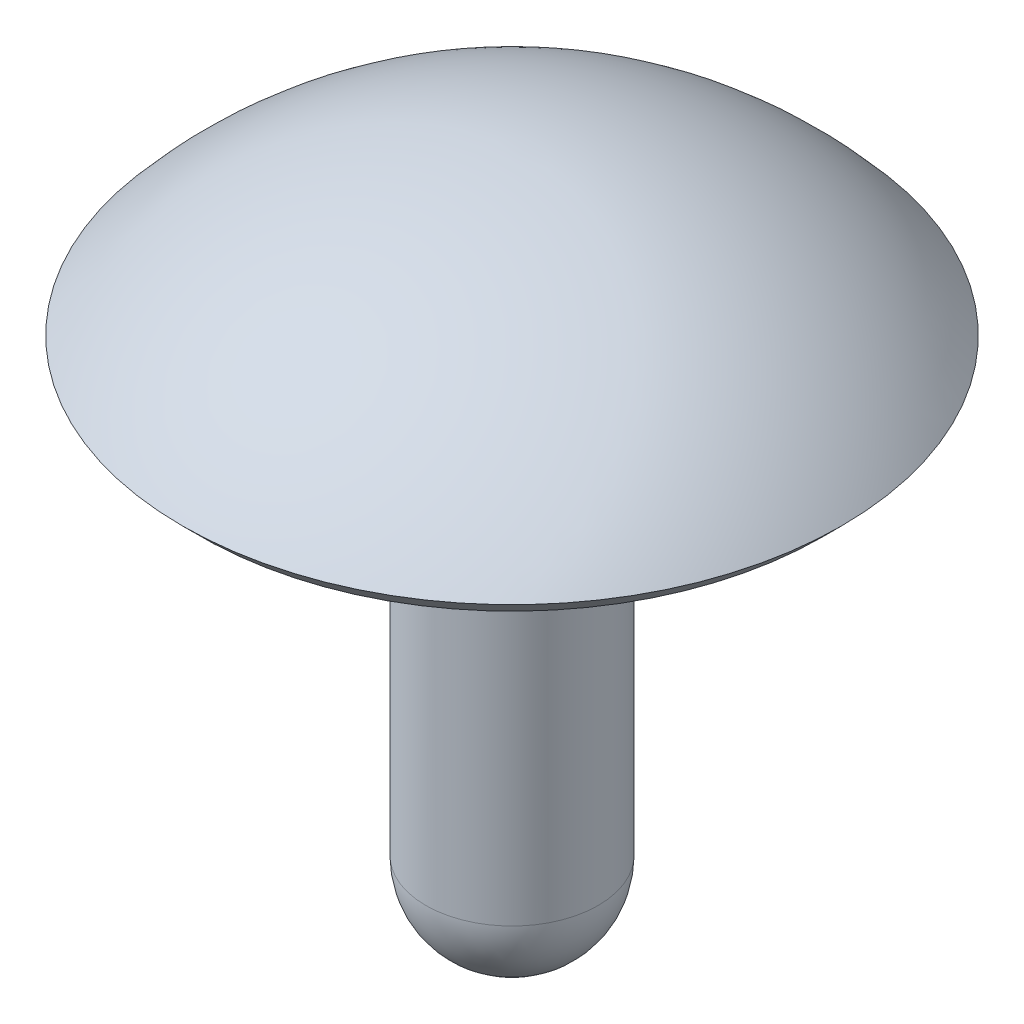
ISO-10303-21;
HEADER;
FILE_DESCRIPTION(('STEP AP214'),'2;1');
FILE_NAME('part.step','',(''),(''),'','','');
FILE_SCHEMA(('AUTOMOTIVE_DESIGN { 1 0 10303 214 1 1 1 1 }'));
ENDSEC;
DATA;
#1=APPLICATION_CONTEXT('core data for automotive mechanical design processes');
#2=APPLICATION_PROTOCOL_DEFINITION('international standard','automotive_design',2000,#1);
#3=PRODUCT_CONTEXT('',#1,'mechanical');
#4=PRODUCT('Part','Part','',(#3));
#5=PRODUCT_RELATED_PRODUCT_CATEGORY('part','',(#4));
#6=PRODUCT_DEFINITION_FORMATION('','',#4);
#7=PRODUCT_DEFINITION_CONTEXT('part definition',#1,'design');
#8=PRODUCT_DEFINITION('design','',#6,#7);
#9=PRODUCT_DEFINITION_SHAPE('','',#8);
#10=(LENGTH_UNIT() NAMED_UNIT(*) SI_UNIT(.MILLI.,.METRE.));
#11=(NAMED_UNIT(*) PLANE_ANGLE_UNIT() SI_UNIT($,.RADIAN.));
#12=(NAMED_UNIT(*) SI_UNIT($,.STERADIAN.) SOLID_ANGLE_UNIT());
#13=UNCERTAINTY_MEASURE_WITH_UNIT(LENGTH_MEASURE(1.E-05),#10,'distance_accuracy_value','');
#14=(GEOMETRIC_REPRESENTATION_CONTEXT(3) GLOBAL_UNCERTAINTY_ASSIGNED_CONTEXT((#13)) GLOBAL_UNIT_ASSIGNED_CONTEXT((#10,
#11,#12)) REPRESENTATION_CONTEXT('',''));
#15=CARTESIAN_POINT('',(0.,0.,0.));
#16=DIRECTION('',(0.,0.,1.));
#17=DIRECTION('',(1.,0.,0.));
#18=AXIS2_PLACEMENT_3D('',#15,#16,#17);
#19=CARTESIAN_POINT('',(0.,6.,0.));
#20=DIRECTION('',(0.,-1.,0.));
#21=DIRECTION('',(0.,0.,-1.));
#22=AXIS2_PLACEMENT_3D('',#19,#20,#21);
#23=CYLINDRICAL_SURFACE('',#22,1.);
#24=CARTESIAN_POINT('',(0.,1.,0.));
#25=DIRECTION('',(0.,-1.,0.));
#26=DIRECTION('',(0.,0.,-1.));
#27=AXIS2_PLACEMENT_3D('',#24,#25,#26);
#28=CIRCLE('',#27,1.);
#29=CARTESIAN_POINT('',(0.,1.,-1.));
#30=VERTEX_POINT('',#29);
#31=EDGE_CURVE('E10',#30,#30,#28,.F.);
#32=ORIENTED_EDGE('',*,*,#31,.T.);
#33=EDGE_LOOP('',(#32));
#34=FACE_BOUND('',#33,.T.);
#35=CARTESIAN_POINT('',(0.,5.,0.));
#36=DIRECTION('',(0.,-1.,0.));
#37=DIRECTION('',(1.,0.,0.));
#38=AXIS2_PLACEMENT_3D('',#35,#36,#37);
#39=CIRCLE('',#38,1.);
#40=CARTESIAN_POINT('',(1.,5.,0.));
#41=VERTEX_POINT('',#40);
#42=EDGE_CURVE('E56',#41,#41,#39,.T.);
#43=ORIENTED_EDGE('',*,*,#42,.T.);
#44=EDGE_LOOP('',(#43));
#45=FACE_BOUND('',#44,.T.);
#46=ADVANCED_FACE('F41',(#34,#45),#23,.T.);
#47=CARTESIAN_POINT('',(0.,6.,0.));
#48=DIRECTION('',(0.,-1.,0.));
#49=DIRECTION('',(1.,0.,0.));
#50=AXIS2_PLACEMENT_3D('',#47,#48,#49);
#51=PLANE('',#50);
#52=CARTESIAN_POINT('',(0.,6.,0.));
#53=DIRECTION('',(0.,-1.,0.));
#54=DIRECTION('',(1.,0.,0.));
#55=AXIS2_PLACEMENT_3D('',#52,#53,#54);
#56=CIRCLE('',#55,3.6);
#57=CARTESIAN_POINT('',(3.6,6.,0.));
#58=VERTEX_POINT('',#57);
#59=EDGE_CURVE('E48',#58,#58,#56,.T.);
#60=ORIENTED_EDGE('',*,*,#59,.T.);
#61=EDGE_LOOP('',(#60));
#62=FACE_BOUND('',#61,.T.);
#63=CARTESIAN_POINT('',(0.,6.,0.));
#64=DIRECTION('',(0.,-1.,0.));
#65=DIRECTION('',(1.,0.,0.));
#66=AXIS2_PLACEMENT_3D('',#63,#64,#65);
#67=CIRCLE('',#66,2.);
#68=CARTESIAN_POINT('',(2.,6.,0.));
#69=VERTEX_POINT('',#68);
#70=EDGE_CURVE('E61',#69,#69,#67,.F.);
#71=ORIENTED_EDGE('',*,*,#70,.T.);
#72=EDGE_LOOP('',(#71));
#73=FACE_BOUND('',#72,.T.);
#74=ADVANCED_FACE('F65',(#62,#73),#51,.T.);
#75=CARTESIAN_POINT('',(0.,3.,0.));
#76=DIRECTION('',(0.,1.,0.));
#77=DIRECTION('',(-1.,0.,0.));
#78=AXIS2_PLACEMENT_3D('',#75,#76,#77);
#79=SPHERICAL_SURFACE('',#78,5.);
#80=CARTESIAN_POINT('',(0.,6.22278299076171,0.));
#81=DIRECTION('',(0.,-1.,0.));
#82=DIRECTION('',(1.,0.,0.));
#83=AXIS2_PLACEMENT_3D('',#80,#81,#82);
#84=CIRCLE('',#83,3.82278299076171);
#85=CARTESIAN_POINT('',(3.82278299076171,6.22278299076171,0.));
#86=VERTEX_POINT('',#85);
#87=EDGE_CURVE('E52',#86,#86,#84,.F.);
#88=ORIENTED_EDGE('',*,*,#87,.T.);
#89=EDGE_LOOP('',(#88));
#90=FACE_BOUND('',#89,.T.);
#91=ADVANCED_FACE('F70',(#90),#79,.T.);
#92=CARTESIAN_POINT('',(0.,5.,0.));
#93=DIRECTION('',(0.,-1.,0.));
#94=DIRECTION('',(1.,0.,0.));
#95=AXIS2_PLACEMENT_3D('',#92,#93,#94);
#96=TOROIDAL_SURFACE('',#95,2.,1.);
#97=ORIENTED_EDGE('',*,*,#42,.F.);
#98=EDGE_LOOP('',(#97));
#99=FACE_BOUND('',#98,.T.);
#100=ORIENTED_EDGE('',*,*,#70,.F.);
#101=EDGE_LOOP('',(#100));
#102=FACE_BOUND('',#101,.T.);
#103=ADVANCED_FACE('F67',(#99,#102),#96,.F.);
#104=CARTESIAN_POINT('',(0.,6.22278299076171,0.));
#105=DIRECTION('',(0.,1.,0.));
#106=DIRECTION('',(-1.,0.,0.));
#107=AXIS2_PLACEMENT_3D('',#104,#105,#106);
#108=CONICAL_SURFACE('',#107,3.82278299076171,0.785398163397448);
#109=ORIENTED_EDGE('',*,*,#59,.F.);
#110=EDGE_LOOP('',(#109));
#111=FACE_BOUND('',#110,.T.);
#112=ORIENTED_EDGE('',*,*,#87,.F.);
#113=EDGE_LOOP('',(#112));
#114=FACE_BOUND('',#113,.T.);
#115=ADVANCED_FACE('F69',(#111,#114),#108,.T.);
#116=CARTESIAN_POINT('',(0.,1.,0.));
#117=DIRECTION('',(0.,1.,0.));
#118=DIRECTION('',(0.,0.,1.));
#119=AXIS2_PLACEMENT_3D('',#116,#117,#118);
#120=SPHERICAL_SURFACE('',#119,1.);
#121=ORIENTED_EDGE('',*,*,#31,.F.);
#122=EDGE_LOOP('',(#121));
#123=FACE_BOUND('',#122,.T.);
#124=ADVANCED_FACE('F43',(#123),#120,.T.);
#125=CLOSED_SHELL('',(#46,#74,#91,#103,#115,#124));
#126=MANIFOLD_SOLID_BREP('B2',#125);
#127=ADVANCED_BREP_SHAPE_REPRESENTATION('',(#18,#126),#14);
#128=SHAPE_DEFINITION_REPRESENTATION(#9,#127);
ENDSEC;
END-ISO-10303-21;
